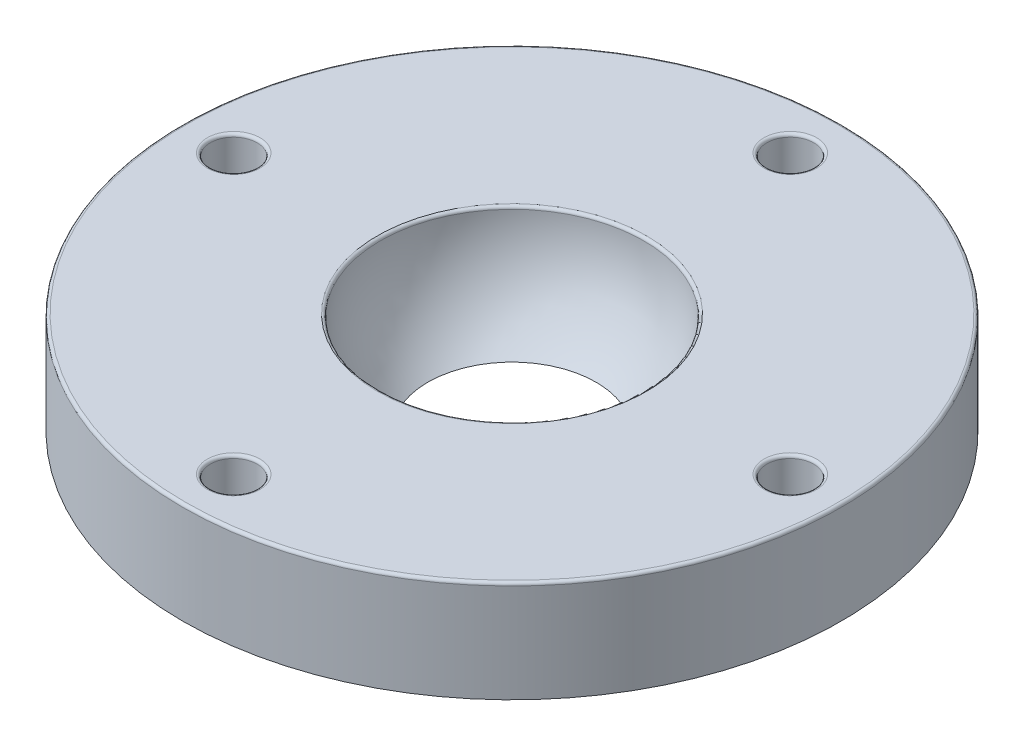
ISO-10303-21;
HEADER;
FILE_DESCRIPTION(('STEP AP214'),'2;1');
FILE_NAME('part.step','',(''),(''),'','','');
FILE_SCHEMA(('AUTOMOTIVE_DESIGN { 1 0 10303 214 1 1 1 1 }'));
ENDSEC;
DATA;
#1=APPLICATION_CONTEXT('core data for automotive mechanical design processes');
#2=APPLICATION_PROTOCOL_DEFINITION('international standard','automotive_design',2000,#1);
#3=PRODUCT_CONTEXT('',#1,'mechanical');
#4=PRODUCT('Part','Part','',(#3));
#5=PRODUCT_RELATED_PRODUCT_CATEGORY('part','',(#4));
#6=PRODUCT_DEFINITION_FORMATION('','',#4);
#7=PRODUCT_DEFINITION_CONTEXT('part definition',#1,'design');
#8=PRODUCT_DEFINITION('design','',#6,#7);
#9=PRODUCT_DEFINITION_SHAPE('','',#8);
#10=(LENGTH_UNIT() NAMED_UNIT(*) SI_UNIT(.MILLI.,.METRE.));
#11=(NAMED_UNIT(*) PLANE_ANGLE_UNIT() SI_UNIT($,.RADIAN.));
#12=(NAMED_UNIT(*) SI_UNIT($,.STERADIAN.) SOLID_ANGLE_UNIT());
#13=UNCERTAINTY_MEASURE_WITH_UNIT(LENGTH_MEASURE(1.E-05),#10,'distance_accuracy_value','');
#14=(GEOMETRIC_REPRESENTATION_CONTEXT(3) GLOBAL_UNCERTAINTY_ASSIGNED_CONTEXT((#13)) GLOBAL_UNIT_ASSIGNED_CONTEXT((#10,
#11,#12)) REPRESENTATION_CONTEXT('',''));
#15=CARTESIAN_POINT('',(0.,0.,0.));
#16=DIRECTION('',(0.,0.,1.));
#17=DIRECTION('',(1.,0.,0.));
#18=AXIS2_PLACEMENT_3D('',#15,#16,#17);
#19=CARTESIAN_POINT('',(0.,6.9282032302755,0.));
#20=DIRECTION('',(0.,-1.,0.));
#21=DIRECTION('',(-1.,0.,0.));
#22=AXIS2_PLACEMENT_3D('',#19,#20,#21);
#23=SPHERICAL_SURFACE('',#22,9.);
#24=CARTESIAN_POINT('',(0.,6.73255105636246,0.));
#25=DIRECTION('',(0.,1.,0.));
#26=DIRECTION('',(0.,0.,1.));
#27=AXIS2_PLACEMENT_3D('',#24,#25,#26);
#28=CIRCLE('',#27,8.99787309461759);
#29=CARTESIAN_POINT('',(-8.99787309461759,6.73255105636246,0.));
#30=VERTEX_POINT('',#29);
#31=EDGE_CURVE('E54',#30,#30,#28,.T.);
#32=CARTESIAN_POINT('',(0.,0.,0.));
#33=DIRECTION('',(0.,-1.,0.));
#34=DIRECTION('',(0.,0.,-1.));
#35=AXIS2_PLACEMENT_3D('',#32,#33,#34);
#36=CIRCLE('',#35,5.74456264653804);
#37=CARTESIAN_POINT('',(-5.74456264653804,0.,0.));
#38=VERTEX_POINT('',#37);
#39=EDGE_CURVE('E81',#38,#38,#36,.T.);
#40=CARTESIAN_POINT('',(-8.99787309461759,6.73255105636246,0.));
#41=CARTESIAN_POINT('',(-8.99612720101107,6.65224620000945,0.));
#42=CARTESIAN_POINT('',(-8.99330569888404,6.57196474481723,0.));
#43=CARTESIAN_POINT('',(-8.98551471450915,6.41150612649697,0.));
#44=CARTESIAN_POINT('',(-8.98054523226129,6.33132896336893,0.));
#45=CARTESIAN_POINT('',(-8.96846152456494,6.17113641891963,0.));
#46=CARTESIAN_POINT('',(-8.96134729911644,6.09112103759837,0.));
#47=CARTESIAN_POINT('',(-8.94497929194505,5.93130941050208,0.));
#48=CARTESIAN_POINT('',(-8.93572551022216,5.85151316472705,0.));
#49=CARTESIAN_POINT('',(-8.91508500059179,5.6921970107458,0.));
#50=CARTESIAN_POINT('',(-8.90369827268431,5.61267710253959,0.));
#51=CARTESIAN_POINT('',(-8.87880003937054,5.45397062619135,0.));
#52=CARTESIAN_POINT('',(-8.86528853396425,5.37478405804934,0.));
#53=CARTESIAN_POINT('',(-8.83615042952032,5.21680102575985,0.));
#54=CARTESIAN_POINT('',(-8.82052383048269,5.13800456161237,0.));
#55=CARTESIAN_POINT('',(-8.7871667409473,4.98085822149812,0.));
#56=CARTESIAN_POINT('',(-8.76943625044955,4.90250834553134,0.));
#57=CARTESIAN_POINT('',(-8.73188408774221,4.74631134586145,0.));
#58=CARTESIAN_POINT('',(-8.71206241553262,4.66846422215834,0.));
#59=CARTESIAN_POINT('',(-8.67034209833864,4.5133285307,0.));
#60=CARTESIAN_POINT('',(-8.64844345335424,4.43603996294477,0.));
#61=CARTESIAN_POINT('',(-8.60258488835737,4.28207678667492,0.));
#62=CARTESIAN_POINT('',(-8.5786249683449,4.20540217816029,0.));
#63=CARTESIAN_POINT('',(-8.52866102864741,4.05272188355525,0.));
#64=CARTESIAN_POINT('',(-8.5026570089624,3.97671619746482,0.));
#65=CARTESIAN_POINT('',(-8.4486235105584,3.82542823138367,0.));
#66=CARTESIAN_POINT('',(-8.42059403183941,3.75014595139294,0.));
#67=CARTESIAN_POINT('',(-8.36252970793042,3.60035876262251,0.));
#68=CARTESIAN_POINT('',(-8.33249486274043,3.5258538538428,0.));
#69=CARTESIAN_POINT('',(-8.27044133597277,3.37767481535743,0.));
#70=CARTESIAN_POINT('',(-8.23842265439511,3.30400068565176,0.));
#71=CARTESIAN_POINT('',(-8.17242440702248,3.15753601764443,0.));
#72=CARTESIAN_POINT('',(-8.13844484122752,3.08474547934277,0.));
#73=CARTESIAN_POINT('',(-8.06854918322471,2.94010017308257,0.));
#74=CARTESIAN_POINT('',(-8.03263309101685,2.86824540512402,0.));
#75=CARTESIAN_POINT('',(-7.95889012616612,2.7255231476945,0.));
#76=CARTESIAN_POINT('',(-7.92106325352325,2.65465565822352,0.));
#77=CARTESIAN_POINT('',(-7.84352584349814,2.51395875819601,0.));
#78=CARTESIAN_POINT('',(-7.80381530611591,2.44412934763947,0.));
#79=CARTESIAN_POINT('',(-7.72253903258805,2.30555866173447,0.));
#80=CARTESIAN_POINT('',(-7.68097329644243,2.23681738638601,0.));
#81=CARTESIAN_POINT('',(-7.59601642123843,2.10047224717555,0.));
#82=CARTESIAN_POINT('',(-7.55262528218005,2.03286838331355,0.));
#83=CARTESIAN_POINT('',(-7.46404870551775,1.89884652801537,0.));
#84=CARTESIAN_POINT('',(-7.41886326791383,1.83242853657919,0.));
#85=CARTESIAN_POINT('',(-7.32673048474501,1.70082603699715,0.));
#86=CARTESIAN_POINT('',(-7.2797831391801,1.6356415288513,0.));
#87=CARTESIAN_POINT('',(-7.18416019368162,1.50655272249995,0.));
#88=CARTESIAN_POINT('',(-7.13548459374804,1.44264842429444,0.));
#89=CARTESIAN_POINT('',(-7.03644003195394,1.31616584680296,0.));
#90=CARTESIAN_POINT('',(-6.98607107009342,1.25358756751698,0.));
#91=CARTESIAN_POINT('',(-6.88367589085206,1.12980188618951,0.));
#92=CARTESIAN_POINT('',(-6.83164967347122,1.06859448414801,0.));
#93=CARTESIAN_POINT('',(-6.72597727720186,0.947594433368445,0.));
#94=CARTESIAN_POINT('',(-6.67233109831334,0.88780178463037,0.));
#95=CARTESIAN_POINT('',(-6.56345723569178,0.769674100767176,0.));
#96=CARTESIAN_POINT('',(-6.50822955195875,0.711339065642056,0.));
#97=CARTESIAN_POINT('',(-6.39623226475826,0.596168430422362,0.));
#98=CARTESIAN_POINT('',(-6.3394626612908,0.539332830327787,0.));
#99=CARTESIAN_POINT('',(-6.22442224457002,0.427201789421904,0.));
#100=CARTESIAN_POINT('',(-6.16615143131672,0.371906348610596,0.));
#101=CARTESIAN_POINT('',(-6.04815030819472,0.262895329760301,0.));
#102=CARTESIAN_POINT('',(-5.98841999832603,0.209179751721313,0.));
#103=CARTESIAN_POINT('',(-5.86754291343342,0.103366718598537,0.));
#104=CARTESIAN_POINT('',(-5.8063961384095,0.0512692635147489,0.));
#105=CARTESIAN_POINT('',(-5.74456264653804,0.,0.));
#106=B_SPLINE_CURVE_WITH_KNOTS('',3,(#40,#41,#42,#43,#44,#45,#46,#47,#48,#49,#50,#51,#52,#53,
#54,#55,#56,#57,#58,#59,#60,#61,#62,#63,#64,#65,#66,#67,#68,#69,#70,#71,#72,#73,#74,#75,#76,#77,
#78,#79,#80,#81,#82,#83,#84,#85,#86,#87,#88,#89,#90,#91,#92,#93,#94,#95,#96,#97,#98,#99,#100,
#101,#102,#103,#104,#105),.UNSPECIFIED.,.F.,.F.,(4,2,2,2,2,2,2,2,2,2,2,2,2,2,2,2,2,2,2,2,2,2,2,
2,2,2,2,2,2,2,2,2,4),(0.,0.24096427877939,0.481928557558782,0.722892836338172,0.963857115117564,
1.20482139389695,1.44578567267634,1.68674995145574,1.92771423023513,2.16867850901452,
2.40964278779391,2.6506070665733,2.89157134535269,3.13253562413208,3.37349990291147,
3.61446418169086,3.85542846047025,4.09639273924964,4.33735701802904,4.57832129680843,
4.81928557558782,5.06024985436721,5.3012141331466,5.54217841192599,5.78314269070538,
6.02410696948477,6.26507124826416,6.50603552704355,6.74699980582294,6.98796408460233,
7.22892836338173,7.46989264216112,7.71085692094051),.UNSPECIFIED.);
#107=EDGE_CURVE('BSEAM34',#30,#38,#106,.T.);
#108=ORIENTED_EDGE('',*,*,#31,.T.);
#109=ORIENTED_EDGE('',*,*,#39,.T.);
#110=ORIENTED_EDGE('',*,*,#107,.T.);
#111=ORIENTED_EDGE('',*,*,#107,.F.);
#112=EDGE_LOOP('',(#108,#110,#109,#111));
#113=FACE_BOUND('',#112,.T.);
#114=ADVANCED_FACE('F34',(#113),#23,.F.);
#115=CARTESIAN_POINT('',(0.,6.9282032302755,0.));
#116=DIRECTION('',(0.,1.,0.));
#117=DIRECTION('',(0.,0.,1.));
#118=AXIS2_PLACEMENT_3D('',#115,#116,#117);
#119=PLANE('',#118);
#120=CARTESIAN_POINT('',(0.,6.9282032302755,0.));
#121=DIRECTION('',(0.,1.,0.));
#122=DIRECTION('',(0.,0.,1.));
#123=AXIS2_PLACEMENT_3D('',#120,#121,#122);
#124=CIRCLE('',#123,22.3);
#125=CARTESIAN_POINT('',(0.,6.9282032302755,22.3));
#126=VERTEX_POINT('',#125);
#127=EDGE_CURVE('E57',#126,#126,#124,.T.);
#128=ORIENTED_EDGE('',*,*,#127,.T.);
#129=EDGE_LOOP('',(#128));
#130=FACE_BOUND('',#129,.T.);
#131=CARTESIAN_POINT('',(0.,6.9282032302755,0.));
#132=DIRECTION('',(0.,1.,0.));
#133=DIRECTION('',(0.,0.,1.));
#134=AXIS2_PLACEMENT_3D('',#131,#132,#133);
#135=CIRCLE('',#134,9.19782583005354);
#136=CARTESIAN_POINT('',(0.,6.9282032302755,9.19782583005354));
#137=VERTEX_POINT('',#136);
#138=EDGE_CURVE('E60',#137,#137,#135,.F.);
#139=ORIENTED_EDGE('',*,*,#138,.T.);
#140=EDGE_LOOP('',(#139));
#141=FACE_BOUND('',#140,.T.);
#142=CARTESIAN_POINT('',(-19.,6.9282032302755,0.));
#143=DIRECTION('',(0.,1.,0.));
#144=DIRECTION('',(0.,0.,1.));
#145=AXIS2_PLACEMENT_3D('',#142,#143,#144);
#146=CIRCLE('',#145,1.8);
#147=CARTESIAN_POINT('',(-19.,6.9282032302755,1.8));
#148=VERTEX_POINT('',#147);
#149=EDGE_CURVE('E63',#148,#148,#146,.F.);
#150=ORIENTED_EDGE('',*,*,#149,.T.);
#151=EDGE_LOOP('',(#150));
#152=FACE_BOUND('',#151,.T.);
#153=CARTESIAN_POINT('',(0.,6.9282032302755,-19.));
#154=DIRECTION('',(0.,1.,0.));
#155=DIRECTION('',(0.,0.,1.));
#156=AXIS2_PLACEMENT_3D('',#153,#154,#155);
#157=CIRCLE('',#156,1.8);
#158=CARTESIAN_POINT('',(0.,6.9282032302755,-17.2));
#159=VERTEX_POINT('',#158);
#160=EDGE_CURVE('E66',#159,#159,#157,.F.);
#161=ORIENTED_EDGE('',*,*,#160,.T.);
#162=EDGE_LOOP('',(#161));
#163=FACE_BOUND('',#162,.T.);
#164=CARTESIAN_POINT('',(19.,6.9282032302755,0.));
#165=DIRECTION('',(0.,1.,0.));
#166=DIRECTION('',(0.,0.,1.));
#167=AXIS2_PLACEMENT_3D('',#164,#165,#166);
#168=CIRCLE('',#167,1.8);
#169=CARTESIAN_POINT('',(19.,6.9282032302755,1.8));
#170=VERTEX_POINT('',#169);
#171=EDGE_CURVE('E69',#170,#170,#168,.F.);
#172=ORIENTED_EDGE('',*,*,#171,.T.);
#173=EDGE_LOOP('',(#172));
#174=FACE_BOUND('',#173,.T.);
#175=CARTESIAN_POINT('',(0.,6.9282032302755,19.));
#176=DIRECTION('',(0.,1.,0.));
#177=DIRECTION('',(0.,0.,1.));
#178=AXIS2_PLACEMENT_3D('',#175,#176,#177);
#179=CIRCLE('',#178,1.8);
#180=CARTESIAN_POINT('',(0.,6.9282032302755,20.8));
#181=VERTEX_POINT('',#180);
#182=EDGE_CURVE('E72',#181,#181,#179,.F.);
#183=ORIENTED_EDGE('',*,*,#182,.T.);
#184=EDGE_LOOP('',(#183));
#185=FACE_BOUND('',#184,.T.);
#186=ADVANCED_FACE('F116',(#130,#141,#152,#163,#174,#185),#119,.T.);
#187=CARTESIAN_POINT('',(0.,6.9282032302755,0.));
#188=DIRECTION('',(0.,-1.,0.));
#189=DIRECTION('',(0.,0.,-1.));
#190=AXIS2_PLACEMENT_3D('',#187,#188,#189);
#191=CYLINDRICAL_SURFACE('',#190,22.5);
#192=CARTESIAN_POINT('',(0.,6.72820323027551,0.));
#193=DIRECTION('',(0.,1.,0.));
#194=DIRECTION('',(0.,0.,1.));
#195=AXIS2_PLACEMENT_3D('',#192,#193,#194);
#196=CIRCLE('',#195,22.5);
#197=CARTESIAN_POINT('',(0.,6.72820323027551,22.5));
#198=VERTEX_POINT('',#197);
#199=EDGE_CURVE('E75',#198,#198,#196,.F.);
#200=ORIENTED_EDGE('',*,*,#199,.T.);
#201=EDGE_LOOP('',(#200));
#202=FACE_BOUND('',#201,.T.);
#203=CARTESIAN_POINT('',(0.,0.,0.));
#204=DIRECTION('',(0.,-1.,0.));
#205=DIRECTION('',(0.,0.,-1.));
#206=AXIS2_PLACEMENT_3D('',#203,#204,#205);
#207=CIRCLE('',#206,22.5);
#208=CARTESIAN_POINT('',(0.,0.,-22.5));
#209=VERTEX_POINT('',#208);
#210=EDGE_CURVE('E78',#209,#209,#207,.T.);
#211=ORIENTED_EDGE('',*,*,#210,.F.);
#212=EDGE_LOOP('',(#211));
#213=FACE_BOUND('',#212,.T.);
#214=ADVANCED_FACE('F123',(#202,#213),#191,.T.);
#215=CARTESIAN_POINT('',(0.,0.,0.));
#216=DIRECTION('',(0.,1.,0.));
#217=DIRECTION('',(0.,0.,1.));
#218=AXIS2_PLACEMENT_3D('',#215,#216,#217);
#219=PLANE('',#218);
#220=CARTESIAN_POINT('',(0.,0.,19.));
#221=DIRECTION('',(0.,1.,0.));
#222=DIRECTION('',(0.,0.,1.));
#223=AXIS2_PLACEMENT_3D('',#220,#221,#222);
#224=CIRCLE('',#223,1.6);
#225=CARTESIAN_POINT('',(0.,0.,20.6));
#226=VERTEX_POINT('',#225);
#227=EDGE_CURVE('E93',#226,#226,#224,.T.);
#228=ORIENTED_EDGE('',*,*,#227,.T.);
#229=EDGE_LOOP('',(#228));
#230=FACE_BOUND('',#229,.T.);
#231=CARTESIAN_POINT('',(19.,0.,0.));
#232=DIRECTION('',(0.,1.,0.));
#233=DIRECTION('',(0.,0.,1.));
#234=AXIS2_PLACEMENT_3D('',#231,#232,#233);
#235=CIRCLE('',#234,1.6);
#236=CARTESIAN_POINT('',(19.,0.,1.6));
#237=VERTEX_POINT('',#236);
#238=EDGE_CURVE('E90',#237,#237,#235,.T.);
#239=ORIENTED_EDGE('',*,*,#238,.T.);
#240=EDGE_LOOP('',(#239));
#241=FACE_BOUND('',#240,.T.);
#242=CARTESIAN_POINT('',(0.,0.,-19.));
#243=DIRECTION('',(0.,1.,0.));
#244=DIRECTION('',(0.,0.,1.));
#245=AXIS2_PLACEMENT_3D('',#242,#243,#244);
#246=CIRCLE('',#245,1.6);
#247=CARTESIAN_POINT('',(0.,0.,-17.4));
#248=VERTEX_POINT('',#247);
#249=EDGE_CURVE('E87',#248,#248,#246,.T.);
#250=ORIENTED_EDGE('',*,*,#249,.T.);
#251=EDGE_LOOP('',(#250));
#252=FACE_BOUND('',#251,.T.);
#253=CARTESIAN_POINT('',(-19.,0.,0.));
#254=DIRECTION('',(0.,1.,0.));
#255=DIRECTION('',(0.,0.,1.));
#256=AXIS2_PLACEMENT_3D('',#253,#254,#255);
#257=CIRCLE('',#256,1.6);
#258=CARTESIAN_POINT('',(-19.,0.,1.6));
#259=VERTEX_POINT('',#258);
#260=EDGE_CURVE('E84',#259,#259,#257,.T.);
#261=ORIENTED_EDGE('',*,*,#260,.T.);
#262=EDGE_LOOP('',(#261));
#263=FACE_BOUND('',#262,.T.);
#264=ORIENTED_EDGE('',*,*,#39,.F.);
#265=EDGE_LOOP('',(#264));
#266=FACE_BOUND('',#265,.T.);
#267=ORIENTED_EDGE('',*,*,#210,.T.);
#268=EDGE_LOOP('',(#267));
#269=FACE_BOUND('',#268,.T.);
#270=ADVANCED_FACE('F97',(#230,#241,#252,#263,#266,#269),#219,.F.);
#271=CARTESIAN_POINT('',(-19.,0.,0.));
#272=DIRECTION('',(0.,1.,0.));
#273=DIRECTION('',(0.,0.,1.));
#274=AXIS2_PLACEMENT_3D('',#271,#272,#273);
#275=CYLINDRICAL_SURFACE('',#274,1.6);
#276=CARTESIAN_POINT('',(-19.,6.72820323027551,0.));
#277=DIRECTION('',(0.,1.,0.));
#278=DIRECTION('',(0.,0.,1.));
#279=AXIS2_PLACEMENT_3D('',#276,#277,#278);
#280=CIRCLE('',#279,1.6);
#281=CARTESIAN_POINT('',(-19.,6.72820323027551,1.6));
#282=VERTEX_POINT('',#281);
#283=EDGE_CURVE('E49',#282,#282,#280,.T.);
#284=ORIENTED_EDGE('',*,*,#283,.T.);
#285=EDGE_LOOP('',(#284));
#286=FACE_BOUND('',#285,.T.);
#287=ORIENTED_EDGE('',*,*,#260,.F.);
#288=EDGE_LOOP('',(#287));
#289=FACE_BOUND('',#288,.T.);
#290=ADVANCED_FACE('F200',(#286,#289),#275,.F.);
#291=CARTESIAN_POINT('',(0.,0.,-19.));
#292=DIRECTION('',(0.,1.,0.));
#293=DIRECTION('',(0.,0.,1.));
#294=AXIS2_PLACEMENT_3D('',#291,#292,#293);
#295=CYLINDRICAL_SURFACE('',#294,1.6);
#296=CARTESIAN_POINT('',(0.,6.72820323027551,-19.));
#297=DIRECTION('',(0.,1.,0.));
#298=DIRECTION('',(0.,0.,1.));
#299=AXIS2_PLACEMENT_3D('',#296,#297,#298);
#300=CIRCLE('',#299,1.6);
#301=CARTESIAN_POINT('',(0.,6.72820323027551,-17.4));
#302=VERTEX_POINT('',#301);
#303=EDGE_CURVE('E45',#302,#302,#300,.T.);
#304=ORIENTED_EDGE('',*,*,#303,.T.);
#305=EDGE_LOOP('',(#304));
#306=FACE_BOUND('',#305,.T.);
#307=ORIENTED_EDGE('',*,*,#249,.F.);
#308=EDGE_LOOP('',(#307));
#309=FACE_BOUND('',#308,.T.);
#310=ADVANCED_FACE('F113',(#306,#309),#295,.F.);
#311=CARTESIAN_POINT('',(19.,0.,0.));
#312=DIRECTION('',(0.,1.,0.));
#313=DIRECTION('',(0.,0.,1.));
#314=AXIS2_PLACEMENT_3D('',#311,#312,#313);
#315=CYLINDRICAL_SURFACE('',#314,1.6);
#316=CARTESIAN_POINT('',(19.,6.72820323027551,0.));
#317=DIRECTION('',(0.,1.,0.));
#318=DIRECTION('',(0.,0.,1.));
#319=AXIS2_PLACEMENT_3D('',#316,#317,#318);
#320=CIRCLE('',#319,1.6);
#321=CARTESIAN_POINT('',(19.,6.72820323027551,1.6));
#322=VERTEX_POINT('',#321);
#323=EDGE_CURVE('E41',#322,#322,#320,.T.);
#324=ORIENTED_EDGE('',*,*,#323,.T.);
#325=EDGE_LOOP('',(#324));
#326=FACE_BOUND('',#325,.T.);
#327=ORIENTED_EDGE('',*,*,#238,.F.);
#328=EDGE_LOOP('',(#327));
#329=FACE_BOUND('',#328,.T.);
#330=ADVANCED_FACE('F103',(#326,#329),#315,.F.);
#331=CARTESIAN_POINT('',(0.,0.,19.));
#332=DIRECTION('',(0.,1.,0.));
#333=DIRECTION('',(0.,0.,1.));
#334=AXIS2_PLACEMENT_3D('',#331,#332,#333);
#335=CYLINDRICAL_SURFACE('',#334,1.6);
#336=CARTESIAN_POINT('',(0.,6.72820323027551,19.));
#337=DIRECTION('',(0.,1.,0.));
#338=DIRECTION('',(0.,0.,1.));
#339=AXIS2_PLACEMENT_3D('',#336,#337,#338);
#340=CIRCLE('',#339,1.6);
#341=CARTESIAN_POINT('',(0.,6.72820323027551,20.6));
#342=VERTEX_POINT('',#341);
#343=EDGE_CURVE('E10',#342,#342,#340,.T.);
#344=ORIENTED_EDGE('',*,*,#343,.T.);
#345=EDGE_LOOP('',(#344));
#346=FACE_BOUND('',#345,.T.);
#347=ORIENTED_EDGE('',*,*,#227,.F.);
#348=EDGE_LOOP('',(#347));
#349=FACE_BOUND('',#348,.T.);
#350=ADVANCED_FACE('F100',(#346,#349),#335,.F.);
#351=CARTESIAN_POINT('',(0.,6.72820323027551,0.));
#352=DIRECTION('',(0.,1.,0.));
#353=DIRECTION('',(0.,0.,1.));
#354=AXIS2_PLACEMENT_3D('',#351,#352,#353);
#355=TOROIDAL_SURFACE('',#354,22.3,0.2);
#356=ORIENTED_EDGE('',*,*,#127,.F.);
#357=EDGE_LOOP('',(#356));
#358=FACE_BOUND('',#357,.T.);
#359=ORIENTED_EDGE('',*,*,#199,.F.);
#360=EDGE_LOOP('',(#359));
#361=FACE_BOUND('',#360,.T.);
#362=ADVANCED_FACE('F102',(#358,#361),#355,.T.);
#363=CARTESIAN_POINT('',(0.,6.72820323027551,0.));
#364=DIRECTION('',(0.,1.,0.));
#365=DIRECTION('',(0.,0.,1.));
#366=AXIS2_PLACEMENT_3D('',#363,#364,#365);
#367=TOROIDAL_SURFACE('',#366,9.19782583005354,0.2);
#368=ORIENTED_EDGE('',*,*,#31,.F.);
#369=EDGE_LOOP('',(#368));
#370=FACE_BOUND('',#369,.T.);
#371=ORIENTED_EDGE('',*,*,#138,.F.);
#372=EDGE_LOOP('',(#371));
#373=FACE_BOUND('',#372,.T.);
#374=ADVANCED_FACE('F110',(#370,#373),#367,.T.);
#375=CARTESIAN_POINT('',(-19.,6.72820323027551,0.));
#376=DIRECTION('',(0.,1.,0.));
#377=DIRECTION('',(0.,0.,1.));
#378=AXIS2_PLACEMENT_3D('',#375,#376,#377);
#379=TOROIDAL_SURFACE('',#378,1.8,0.2);
#380=ORIENTED_EDGE('',*,*,#149,.F.);
#381=EDGE_LOOP('',(#380));
#382=FACE_BOUND('',#381,.T.);
#383=ORIENTED_EDGE('',*,*,#283,.F.);
#384=EDGE_LOOP('',(#383));
#385=FACE_BOUND('',#384,.T.);
#386=ADVANCED_FACE('F131',(#382,#385),#379,.T.);
#387=CARTESIAN_POINT('',(0.,6.72820323027551,-19.));
#388=DIRECTION('',(0.,1.,0.));
#389=DIRECTION('',(0.,0.,1.));
#390=AXIS2_PLACEMENT_3D('',#387,#388,#389);
#391=TOROIDAL_SURFACE('',#390,1.8,0.2);
#392=ORIENTED_EDGE('',*,*,#160,.F.);
#393=EDGE_LOOP('',(#392));
#394=FACE_BOUND('',#393,.T.);
#395=ORIENTED_EDGE('',*,*,#303,.F.);
#396=EDGE_LOOP('',(#395));
#397=FACE_BOUND('',#396,.T.);
#398=ADVANCED_FACE('F135',(#394,#397),#391,.T.);
#399=CARTESIAN_POINT('',(19.,6.72820323027551,0.));
#400=DIRECTION('',(0.,1.,0.));
#401=DIRECTION('',(0.,0.,1.));
#402=AXIS2_PLACEMENT_3D('',#399,#400,#401);
#403=TOROIDAL_SURFACE('',#402,1.8,0.2);
#404=ORIENTED_EDGE('',*,*,#171,.F.);
#405=EDGE_LOOP('',(#404));
#406=FACE_BOUND('',#405,.T.);
#407=ORIENTED_EDGE('',*,*,#323,.F.);
#408=EDGE_LOOP('',(#407));
#409=FACE_BOUND('',#408,.T.);
#410=ADVANCED_FACE('F138',(#406,#409),#403,.T.);
#411=CARTESIAN_POINT('',(0.,6.72820323027551,19.));
#412=DIRECTION('',(0.,1.,0.));
#413=DIRECTION('',(0.,0.,1.));
#414=AXIS2_PLACEMENT_3D('',#411,#412,#413);
#415=TOROIDAL_SURFACE('',#414,1.8,0.2);
#416=ORIENTED_EDGE('',*,*,#182,.F.);
#417=EDGE_LOOP('',(#416));
#418=FACE_BOUND('',#417,.T.);
#419=ORIENTED_EDGE('',*,*,#343,.F.);
#420=EDGE_LOOP('',(#419));
#421=FACE_BOUND('',#420,.T.);
#422=ADVANCED_FACE('F36',(#418,#421),#415,.T.);
#423=CLOSED_SHELL('',(#114,#186,#214,#270,#290,#310,#330,#350,#362,#374,#386,#398,#410,#422));
#424=MANIFOLD_SOLID_BREP('B2',#423);
#425=ADVANCED_BREP_SHAPE_REPRESENTATION('',(#18,#424),#14);
#426=SHAPE_DEFINITION_REPRESENTATION(#9,#425);
ENDSEC;
END-ISO-10303-21;
